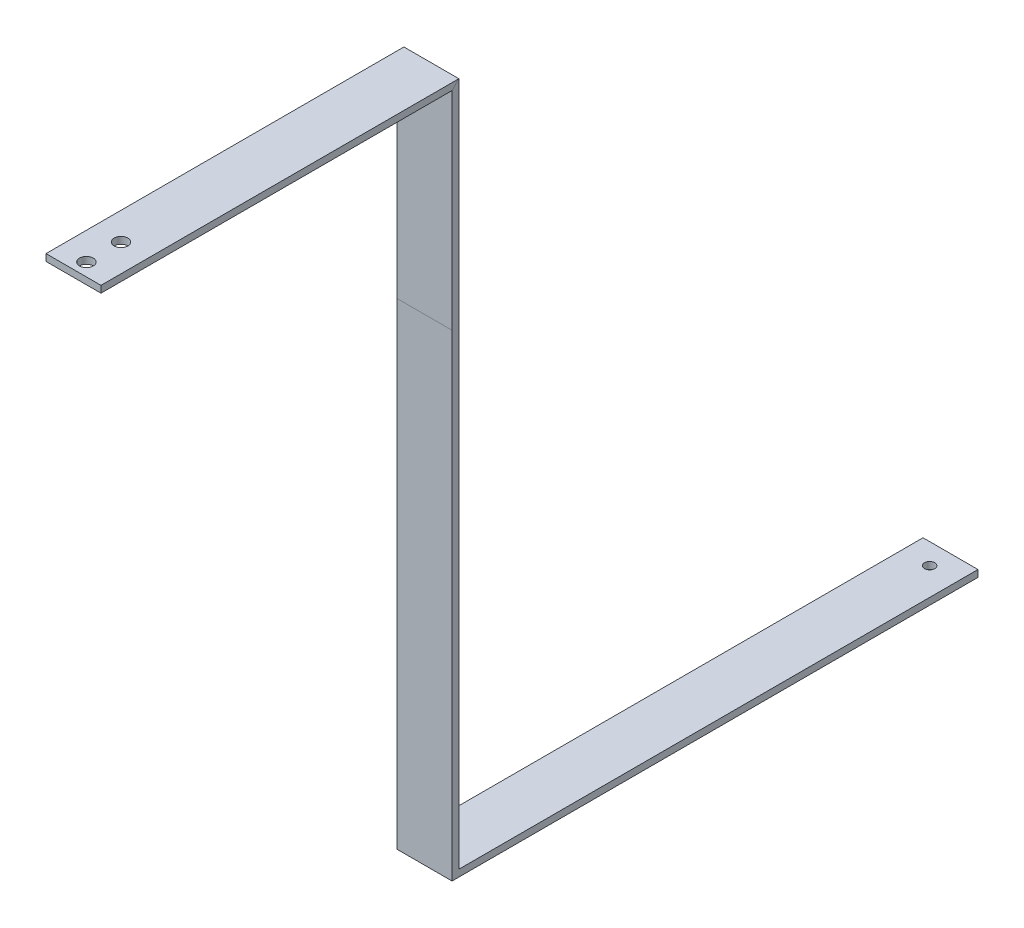
ISO-10303-21;
HEADER;
FILE_DESCRIPTION(('STEP AP214'),'2;1');
FILE_NAME('part.step','',(''),(''),'','','');
FILE_SCHEMA(('AUTOMOTIVE_DESIGN { 1 0 10303 214 1 1 1 1 }'));
ENDSEC;
DATA;
#1=APPLICATION_CONTEXT('core data for automotive mechanical design processes');
#2=APPLICATION_PROTOCOL_DEFINITION('international standard','automotive_design',2000,#1);
#3=PRODUCT_CONTEXT('',#1,'mechanical');
#4=PRODUCT('Part','Part','',(#3));
#5=PRODUCT_RELATED_PRODUCT_CATEGORY('part','',(#4));
#6=PRODUCT_DEFINITION_FORMATION('','',#4);
#7=PRODUCT_DEFINITION_CONTEXT('part definition',#1,'design');
#8=PRODUCT_DEFINITION('design','',#6,#7);
#9=PRODUCT_DEFINITION_SHAPE('','',#8);
#10=(LENGTH_UNIT() NAMED_UNIT(*) SI_UNIT(.MILLI.,.METRE.));
#11=(NAMED_UNIT(*) PLANE_ANGLE_UNIT() SI_UNIT($,.RADIAN.));
#12=(NAMED_UNIT(*) SI_UNIT($,.STERADIAN.) SOLID_ANGLE_UNIT());
#13=UNCERTAINTY_MEASURE_WITH_UNIT(LENGTH_MEASURE(1.E-05),#10,'distance_accuracy_value','');
#14=(GEOMETRIC_REPRESENTATION_CONTEXT(3) GLOBAL_UNCERTAINTY_ASSIGNED_CONTEXT((#13)) GLOBAL_UNIT_ASSIGNED_CONTEXT((#10,
#11,#12)) REPRESENTATION_CONTEXT('',''));
#15=CARTESIAN_POINT('',(0.,0.,0.));
#16=DIRECTION('',(0.,0.,1.));
#17=DIRECTION('',(1.,0.,0.));
#18=AXIS2_PLACEMENT_3D('',#15,#16,#17);
#19=CARTESIAN_POINT('',(-96.5999999999999,-272.07792076474,612.092449283312));
#20=DIRECTION('',(0.,-1.,0.));
#21=DIRECTION('',(0.,0.,-1.));
#22=AXIS2_PLACEMENT_3D('',#19,#20,#21);
#23=PLANE('',#22);
#24=DIRECTION('',(-1.,0.,0.));
#25=VECTOR('',#24,1.);
#26=CARTESIAN_POINT('',(-96.5999999999999,-272.07792076474,0.00397627219106411));
#27=LINE('',#26,#25);
#28=CARTESIAN_POINT('',(25.4,-272.07792076474,0.0039762721910086));
#29=VERTEX_POINT('',#28);
#30=CARTESIAN_POINT('',(-25.4,-272.07792076474,0.00397627219106411));
#31=VERTEX_POINT('',#30);
#32=EDGE_CURVE('E11',#29,#31,#27,.T.);
#33=ORIENTED_EDGE('',*,*,#32,.F.);
#34=DIRECTION('',(0.,0.,-1.));
#35=VECTOR('',#34,1.);
#36=CARTESIAN_POINT('',(25.4,-272.07792076474,612.092449283312));
#37=LINE('',#36,#35);
#38=CARTESIAN_POINT('',(25.4,-272.07792076474,0.));
#39=VERTEX_POINT('',#38);
#40=EDGE_CURVE('E163',#29,#39,#37,.T.);
#41=ORIENTED_EDGE('',*,*,#40,.T.);
#42=DIRECTION('',(1.,0.,0.));
#43=VECTOR('',#42,1.);
#44=CARTESIAN_POINT('',(0.,-272.07792076474,0.));
#45=LINE('',#44,#43);
#46=CARTESIAN_POINT('',(-25.4,-272.07792076474,0.));
#47=VERTEX_POINT('',#46);
#48=EDGE_CURVE('E280',#47,#39,#45,.T.);
#49=ORIENTED_EDGE('',*,*,#48,.F.);
#50=DIRECTION('',(0.,0.,-1.));
#51=VECTOR('',#50,1.);
#52=CARTESIAN_POINT('',(-25.4,-272.07792076474,574.));
#53=LINE('',#52,#51);
#54=EDGE_CURVE('E276',#31,#47,#53,.T.);
#55=ORIENTED_EDGE('',*,*,#54,.F.);
#56=EDGE_LOOP('',(#33,#41,#49,#55));
#57=FACE_BOUND('',#56,.T.);
#58=ADVANCED_FACE('F34',(#57),#23,.F.);
#59=CARTESIAN_POINT('',(25.4,3.155,574.));
#60=DIRECTION('',(-1.,0.,0.));
#61=DIRECTION('',(0.,0.,1.));
#62=AXIS2_PLACEMENT_3D('',#59,#60,#61);
#63=PLANE('',#62);
#64=DIRECTION('',(0.,1.,0.));
#65=VECTOR('',#64,1.);
#66=CARTESIAN_POINT('',(25.4,-278.803420764741,6.3139762721911));
#67=LINE('',#66,#65);
#68=CARTESIAN_POINT('',(25.4,-272.078734833776,6.31088055029496));
#69=VERTEX_POINT('',#68);
#70=CARTESIAN_POINT('',(25.4,-80.2379207647403,6.31397627219108));
#71=VERTEX_POINT('',#70);
#72=EDGE_CURVE('E177',#69,#71,#67,.T.);
#73=ORIENTED_EDGE('',*,*,#72,.F.);
#74=DIRECTION('',(0.,1.,0.));
#75=VECTOR('',#74,1.);
#76=CARTESIAN_POINT('',(25.4,-712.845,6.31000000000004));
#77=LINE('',#76,#75);
#78=CARTESIAN_POINT('',(25.4,-712.845,6.31000000000004));
#79=VERTEX_POINT('',#78);
#80=EDGE_CURVE('E38',#79,#69,#77,.T.);
#81=ORIENTED_EDGE('',*,*,#80,.F.);
#82=DIRECTION('',(0.,0.,-1.));
#83=VECTOR('',#82,1.);
#84=CARTESIAN_POINT('',(25.4,-712.845,0.));
#85=LINE('',#84,#83);
#86=CARTESIAN_POINT('',(25.4,-712.845,-479.69));
#87=VERTEX_POINT('',#86);
#88=EDGE_CURVE('E129',#79,#87,#85,.T.);
#89=ORIENTED_EDGE('',*,*,#88,.T.);
#90=DIRECTION('',(0.,1.,0.));
#91=VECTOR('',#90,1.);
#92=CARTESIAN_POINT('',(25.4,-706.535,-479.69));
#93=LINE('',#92,#91);
#94=CARTESIAN_POINT('',(25.4,-706.535,-479.69));
#95=VERTEX_POINT('',#94);
#96=EDGE_CURVE('E139',#87,#95,#93,.T.);
#97=ORIENTED_EDGE('',*,*,#96,.T.);
#98=DIRECTION('',(0.,0.,1.));
#99=VECTOR('',#98,1.);
#100=CARTESIAN_POINT('',(25.4,-706.535,-479.69));
#101=LINE('',#100,#99);
#102=CARTESIAN_POINT('',(25.4,-706.535,0.));
#103=VERTEX_POINT('',#102);
#104=EDGE_CURVE('E154',#95,#103,#101,.T.);
#105=ORIENTED_EDGE('',*,*,#104,.T.);
#106=DIRECTION('',(0.,1.,0.));
#107=VECTOR('',#106,1.);
#108=CARTESIAN_POINT('',(25.4,3.155,0.));
#109=LINE('',#108,#107);
#110=EDGE_CURVE('E52',#103,#39,#109,.T.);
#111=ORIENTED_EDGE('',*,*,#110,.T.);
#112=ORIENTED_EDGE('',*,*,#40,.F.);
#113=DIRECTION('',(0.,1.,0.));
#114=VECTOR('',#113,1.);
#115=CARTESIAN_POINT('',(25.4,-278.803420764741,0.0039762721910086));
#116=LINE('',#115,#114);
#117=CARTESIAN_POINT('',(25.4,-73.9279207647402,0.00397627219099014));
#118=VERTEX_POINT('',#117);
#119=EDGE_CURVE('E175',#29,#118,#116,.T.);
#120=ORIENTED_EDGE('',*,*,#119,.T.);
#121=DIRECTION('',(0.,0.707106781186548,-0.707106781186548));
#122=VECTOR('',#121,1.);
#123=CARTESIAN_POINT('',(25.4,-176.36567076474,102.441726272191));
#124=LINE('',#123,#122);
#125=EDGE_CURVE('E170',#71,#118,#124,.T.);
#126=ORIENTED_EDGE('',*,*,#125,.F.);
#127=EDGE_LOOP('',(#73,#81,#89,#97,#105,#111,#112,#120,#126));
#128=FACE_BOUND('',#127,.T.);
#129=ADVANCED_FACE('F36',(#128),#63,.F.);
#130=CARTESIAN_POINT('',(-25.4,3.155,574.));
#131=DIRECTION('',(1.,0.,0.));
#132=DIRECTION('',(0.,0.,-1.));
#133=AXIS2_PLACEMENT_3D('',#130,#131,#132);
#134=PLANE('',#133);
#135=DIRECTION('',(0.,-1.,0.));
#136=VECTOR('',#135,1.);
#137=CARTESIAN_POINT('',(-25.4,3.155,0.));
#138=LINE('',#137,#136);
#139=CARTESIAN_POINT('',(-25.4,-706.535,0.));
#140=VERTEX_POINT('',#139);
#141=EDGE_CURVE('E274',#47,#140,#138,.T.);
#142=ORIENTED_EDGE('',*,*,#141,.T.);
#143=DIRECTION('',(0.,0.,1.));
#144=VECTOR('',#143,1.);
#145=CARTESIAN_POINT('',(-25.4,-706.535,-479.69));
#146=LINE('',#145,#144);
#147=CARTESIAN_POINT('',(-25.4,-706.535,-479.69));
#148=VERTEX_POINT('',#147);
#149=EDGE_CURVE('E143',#148,#140,#146,.T.);
#150=ORIENTED_EDGE('',*,*,#149,.F.);
#151=DIRECTION('',(0.,-1.,0.));
#152=VECTOR('',#151,1.);
#153=CARTESIAN_POINT('',(-25.4,-706.535,-479.69));
#154=LINE('',#153,#152);
#155=CARTESIAN_POINT('',(-25.4,-712.845,-479.69));
#156=VERTEX_POINT('',#155);
#157=EDGE_CURVE('E136',#148,#156,#154,.T.);
#158=ORIENTED_EDGE('',*,*,#157,.T.);
#159=DIRECTION('',(0.,0.,1.));
#160=VECTOR('',#159,1.);
#161=CARTESIAN_POINT('',(-25.4,-712.845,0.));
#162=LINE('',#161,#160);
#163=CARTESIAN_POINT('',(-25.4,-712.845,6.31000000000004));
#164=VERTEX_POINT('',#163);
#165=EDGE_CURVE('E120',#156,#164,#162,.T.);
#166=ORIENTED_EDGE('',*,*,#165,.T.);
#167=DIRECTION('',(0.,1.,0.));
#168=VECTOR('',#167,1.);
#169=CARTESIAN_POINT('',(-25.4,-712.845,6.31000000000004));
#170=LINE('',#169,#168);
#171=CARTESIAN_POINT('',(-25.4,-272.078734833776,6.31088055029493));
#172=VERTEX_POINT('',#171);
#173=EDGE_CURVE('E262',#164,#172,#170,.T.);
#174=ORIENTED_EDGE('',*,*,#173,.T.);
#175=DIRECTION('',(0.,1.,0.));
#176=VECTOR('',#175,1.);
#177=CARTESIAN_POINT('',(-25.4,-278.803420764741,6.31397627219099));
#178=LINE('',#177,#176);
#179=CARTESIAN_POINT('',(-25.4,-80.2379207647402,6.313976272191));
#180=VERTEX_POINT('',#179);
#181=EDGE_CURVE('E173',#172,#180,#178,.T.);
#182=ORIENTED_EDGE('',*,*,#181,.T.);
#183=DIRECTION('',(0.,-0.707106781186548,0.707106781186548));
#184=VECTOR('',#183,1.);
#185=CARTESIAN_POINT('',(-25.4,-176.36567076474,102.441726272191));
#186=LINE('',#185,#184);
#187=CARTESIAN_POINT('',(-25.4,-73.9279207647402,0.00397627219099045));
#188=VERTEX_POINT('',#187);
#189=EDGE_CURVE('E164',#188,#180,#186,.T.);
#190=ORIENTED_EDGE('',*,*,#189,.F.);
#191=DIRECTION('',(0.,1.,0.));
#192=VECTOR('',#191,1.);
#193=CARTESIAN_POINT('',(-25.4,-278.803420764741,0.0039762721910086));
#194=LINE('',#193,#192);
#195=EDGE_CURVE('E171',#31,#188,#194,.T.);
#196=ORIENTED_EDGE('',*,*,#195,.F.);
#197=ORIENTED_EDGE('',*,*,#54,.T.);
#198=EDGE_LOOP('',(#142,#150,#158,#166,#174,#182,#190,#196,#197));
#199=FACE_BOUND('',#198,.T.);
#200=ADVANCED_FACE('F141',(#199),#134,.F.);
#201=CARTESIAN_POINT('',(0.,0.,0.));
#202=DIRECTION('',(0.,0.,1.));
#203=DIRECTION('',(1.,0.,0.));
#204=AXIS2_PLACEMENT_3D('',#201,#202,#203);
#205=PLANE('',#204);
#206=ORIENTED_EDGE('',*,*,#110,.F.);
#207=DIRECTION('',(-1.,0.,0.));
#208=VECTOR('',#207,1.);
#209=CARTESIAN_POINT('',(0.,-706.535,0.));
#210=LINE('',#209,#208);
#211=EDGE_CURVE('E56',#103,#140,#210,.T.);
#212=ORIENTED_EDGE('',*,*,#211,.T.);
#213=ORIENTED_EDGE('',*,*,#141,.F.);
#214=ORIENTED_EDGE('',*,*,#48,.T.);
#215=EDGE_LOOP('',(#206,#212,#213,#214));
#216=FACE_BOUND('',#215,.T.);
#217=ADVANCED_FACE('F256',(#216),#205,.F.);
#218=CARTESIAN_POINT('',(-25.4,-712.845,6.31000000000004));
#219=DIRECTION('',(0.,0.,1.));
#220=DIRECTION('',(1.,0.,0.));
#221=AXIS2_PLACEMENT_3D('',#218,#219,#220);
#222=PLANE('',#221);
#223=CARTESIAN_POINT('',(-25.4,-272.07792076474,6.31397627219099));
#224=DIRECTION('',(1.,0.,0.));
#225=VECTOR('',#224,1.);
#226=LINE('',#223,#225);
#227=EDGE_CURVE('E44',#172,#69,#226,.T.);
#228=ORIENTED_EDGE('',*,*,#227,.F.);
#229=ORIENTED_EDGE('',*,*,#173,.F.);
#230=DIRECTION('',(1.,0.,0.));
#231=VECTOR('',#230,1.);
#232=CARTESIAN_POINT('',(-25.4,-712.845,6.31000000000004));
#233=LINE('',#232,#231);
#234=EDGE_CURVE('E126',#164,#79,#233,.T.);
#235=ORIENTED_EDGE('',*,*,#234,.T.);
#236=ORIENTED_EDGE('',*,*,#80,.T.);
#237=EDGE_LOOP('',(#228,#229,#235,#236));
#238=FACE_BOUND('',#237,.T.);
#239=ADVANCED_FACE('F251',(#238),#222,.T.);
#240=CARTESIAN_POINT('',(0.,-712.845,0.));
#241=DIRECTION('',(0.,1.,0.));
#242=DIRECTION('',(0.,0.,1.));
#243=AXIS2_PLACEMENT_3D('',#240,#241,#242);
#244=PLANE('',#243);
#245=CARTESIAN_POINT('',(-1.4210854715202E-11,-712.845,-460.392204665726));
#246=DIRECTION('',(0.,1.,0.));
#247=DIRECTION('',(0.,0.,1.));
#248=AXIS2_PLACEMENT_3D('',#245,#246,#247);
#249=CIRCLE('',#248,4.7499999999999);
#250=CARTESIAN_POINT('',(-1.4210854715202E-11,-712.845,-455.642204665726));
#251=VERTEX_POINT('',#250);
#252=EDGE_CURVE('E144',#251,#251,#249,.T.);
#253=ORIENTED_EDGE('',*,*,#252,.T.);
#254=EDGE_LOOP('',(#253));
#255=FACE_BOUND('',#254,.T.);
#256=ORIENTED_EDGE('',*,*,#88,.F.);
#257=ORIENTED_EDGE('',*,*,#234,.F.);
#258=ORIENTED_EDGE('',*,*,#165,.F.);
#259=DIRECTION('',(1.,0.,0.));
#260=VECTOR('',#259,1.);
#261=CARTESIAN_POINT('',(25.4,-712.845,-479.69));
#262=LINE('',#261,#260);
#263=EDGE_CURVE('E124',#156,#87,#262,.T.);
#264=ORIENTED_EDGE('',*,*,#263,.T.);
#265=EDGE_LOOP('',(#256,#257,#258,#264));
#266=FACE_BOUND('',#265,.T.);
#267=ADVANCED_FACE('F123',(#255,#266),#244,.F.);
#268=CARTESIAN_POINT('',(-25.4,-278.803420764741,0.0039762721910086));
#269=DIRECTION('',(0.,0.,1.));
#270=DIRECTION('',(1.,0.,0.));
#271=AXIS2_PLACEMENT_3D('',#268,#269,#270);
#272=PLANE('',#271);
#273=ORIENTED_EDGE('',*,*,#119,.F.);
#274=ORIENTED_EDGE('',*,*,#32,.T.);
#275=ORIENTED_EDGE('',*,*,#195,.T.);
#276=DIRECTION('',(-1.,0.,0.));
#277=VECTOR('',#276,1.);
#278=CARTESIAN_POINT('',(-25.4,-73.9279207647403,0.0039762721910086));
#279=LINE('',#278,#277);
#280=EDGE_CURVE('E167',#118,#188,#279,.T.);
#281=ORIENTED_EDGE('',*,*,#280,.F.);
#282=EDGE_LOOP('',(#273,#274,#275,#281));
#283=FACE_BOUND('',#282,.T.);
#284=ADVANCED_FACE('F222',(#283),#272,.F.);
#285=CARTESIAN_POINT('',(0.,-352.315841529481,330.708976272191));
#286=DIRECTION('',(0.,0.,1.));
#287=DIRECTION('',(-1.,0.,0.));
#288=AXIS2_PLACEMENT_3D('',#285,#286,#287);
#289=PLANE('',#288);
#290=DIRECTION('',(0.,-1.,0.));
#291=VECTOR('',#290,1.);
#292=CARTESIAN_POINT('',(25.4,-73.9279207647402,330.708976272191));
#293=LINE('',#292,#291);
#294=CARTESIAN_POINT('',(25.4,-73.9279207647402,330.708976272191));
#295=VERTEX_POINT('',#294);
#296=CARTESIAN_POINT('',(25.4,-80.2379207647403,330.708976272191));
#297=VERTEX_POINT('',#296);
#298=EDGE_CURVE('E185',#295,#297,#293,.T.);
#299=ORIENTED_EDGE('',*,*,#298,.F.);
#300=DIRECTION('',(1.,0.,0.));
#301=VECTOR('',#300,1.);
#302=CARTESIAN_POINT('',(-25.4,-73.9279207647402,330.708976272191));
#303=LINE('',#302,#301);
#304=CARTESIAN_POINT('',(-25.4,-73.9279207647402,330.708976272191));
#305=VERTEX_POINT('',#304);
#306=EDGE_CURVE('E159',#305,#295,#303,.T.);
#307=ORIENTED_EDGE('',*,*,#306,.F.);
#308=DIRECTION('',(0.,1.,0.));
#309=VECTOR('',#308,1.);
#310=CARTESIAN_POINT('',(-25.4,-73.9279207647402,330.708976272191));
#311=LINE('',#310,#309);
#312=CARTESIAN_POINT('',(-25.4,-80.2379207647402,330.708976272191));
#313=VERTEX_POINT('',#312);
#314=EDGE_CURVE('E181',#313,#305,#311,.T.);
#315=ORIENTED_EDGE('',*,*,#314,.F.);
#316=DIRECTION('',(-1.,0.,0.));
#317=VECTOR('',#316,1.);
#318=CARTESIAN_POINT('',(-25.4,-80.2379207647402,330.708976272191));
#319=LINE('',#318,#317);
#320=EDGE_CURVE('E183',#297,#313,#319,.T.);
#321=ORIENTED_EDGE('',*,*,#320,.F.);
#322=EDGE_LOOP('',(#299,#307,#315,#321));
#323=FACE_BOUND('',#322,.T.);
#324=ADVANCED_FACE('F226',(#323),#289,.T.);
#325=CARTESIAN_POINT('',(25.4,-73.9279207647402,-0.411523727809043));
#326=DIRECTION('',(-1.,0.,0.));
#327=DIRECTION('',(0.,-1.,0.));
#328=AXIS2_PLACEMENT_3D('',#325,#326,#327);
#329=PLANE('',#328);
#330=ORIENTED_EDGE('',*,*,#125,.T.);
#331=DIRECTION('',(0.,0.,1.));
#332=VECTOR('',#331,1.);
#333=CARTESIAN_POINT('',(25.4,-73.9279207647402,-0.411523727809043));
#334=LINE('',#333,#332);
#335=EDGE_CURVE('E174',#118,#295,#334,.T.);
#336=ORIENTED_EDGE('',*,*,#335,.T.);
#337=ORIENTED_EDGE('',*,*,#298,.T.);
#338=DIRECTION('',(0.,0.,1.));
#339=VECTOR('',#338,1.);
#340=CARTESIAN_POINT('',(25.4,-80.2379207647403,-0.411523727809042));
#341=LINE('',#340,#339);
#342=EDGE_CURVE('E193',#71,#297,#341,.T.);
#343=ORIENTED_EDGE('',*,*,#342,.F.);
#344=EDGE_LOOP('',(#330,#336,#337,#343));
#345=FACE_BOUND('',#344,.T.);
#346=ADVANCED_FACE('F228',(#345),#329,.F.);
#347=CARTESIAN_POINT('',(-25.4,-80.2379207647402,-0.411523727809042));
#348=DIRECTION('',(0.,1.,0.));
#349=DIRECTION('',(-1.,0.,0.));
#350=AXIS2_PLACEMENT_3D('',#347,#348,#349);
#351=PLANE('',#350);
#352=CARTESIAN_POINT('',(-1.9443998652135E-13,-80.2379207647402,286.807795334274));
#353=DIRECTION('',(0.,1.,0.));
#354=DIRECTION('',(-1.,0.,0.));
#355=AXIS2_PLACEMENT_3D('',#352,#353,#354);
#356=CIRCLE('',#355,6.35000000001451);
#357=CARTESIAN_POINT('',(-6.3500000000147,-80.2379207647402,286.807795334274));
#358=VERTEX_POINT('',#357);
#359=EDGE_CURVE('E411',#358,#358,#356,.T.);
#360=ORIENTED_EDGE('',*,*,#359,.T.);
#361=EDGE_LOOP('',(#360));
#362=FACE_BOUND('',#361,.T.);
#363=CARTESIAN_POINT('',(1.49841716905026E-11,-80.2379207647402,318.807795334274));
#364=DIRECTION('',(0.,1.,0.));
#365=DIRECTION('',(-1.,0.,0.));
#366=AXIS2_PLACEMENT_3D('',#363,#364,#365);
#367=CIRCLE('',#366,6.34999999999997);
#368=CARTESIAN_POINT('',(-6.34999999998498,-80.2379207647402,318.807795334274));
#369=VERTEX_POINT('',#368);
#370=EDGE_CURVE('E404',#369,#369,#367,.T.);
#371=ORIENTED_EDGE('',*,*,#370,.T.);
#372=EDGE_LOOP('',(#371));
#373=FACE_BOUND('',#372,.T.);
#374=DIRECTION('',(1.,0.,0.));
#375=VECTOR('',#374,1.);
#376=CARTESIAN_POINT('',(-25.3999999999996,-80.2379207647402,6.31397627219099));
#377=LINE('',#376,#375);
#378=EDGE_CURVE('E160',#180,#71,#377,.T.);
#379=ORIENTED_EDGE('',*,*,#378,.T.);
#380=ORIENTED_EDGE('',*,*,#342,.T.);
#381=ORIENTED_EDGE('',*,*,#320,.T.);
#382=DIRECTION('',(0.,0.,1.));
#383=VECTOR('',#382,1.);
#384=CARTESIAN_POINT('',(-25.4,-80.2379207647402,-0.411523727809042));
#385=LINE('',#384,#383);
#386=EDGE_CURVE('E190',#180,#313,#385,.T.);
#387=ORIENTED_EDGE('',*,*,#386,.F.);
#388=EDGE_LOOP('',(#379,#380,#381,#387));
#389=FACE_BOUND('',#388,.T.);
#390=ADVANCED_FACE('F231',(#362,#373,#389),#351,.F.);
#391=CARTESIAN_POINT('',(-25.4,-73.9279207647402,-0.411523727809043));
#392=DIRECTION('',(1.,0.,0.));
#393=DIRECTION('',(0.,1.,0.));
#394=AXIS2_PLACEMENT_3D('',#391,#392,#393);
#395=PLANE('',#394);
#396=ORIENTED_EDGE('',*,*,#189,.T.);
#397=ORIENTED_EDGE('',*,*,#386,.T.);
#398=ORIENTED_EDGE('',*,*,#314,.T.);
#399=DIRECTION('',(0.,0.,1.));
#400=VECTOR('',#399,1.);
#401=CARTESIAN_POINT('',(-25.4,-73.9279207647402,-0.411523727809043));
#402=LINE('',#401,#400);
#403=EDGE_CURVE('E187',#188,#305,#402,.T.);
#404=ORIENTED_EDGE('',*,*,#403,.F.);
#405=EDGE_LOOP('',(#396,#397,#398,#404));
#406=FACE_BOUND('',#405,.T.);
#407=ADVANCED_FACE('F235',(#406),#395,.F.);
#408=CARTESIAN_POINT('',(-25.4,-73.9279207647402,-0.411523727809043));
#409=DIRECTION('',(0.,-1.,0.));
#410=DIRECTION('',(1.,0.,0.));
#411=AXIS2_PLACEMENT_3D('',#408,#409,#410);
#412=PLANE('',#411);
#413=CARTESIAN_POINT('',(-1.94138072097452E-13,-73.9279207647402,286.807795334274));
#414=DIRECTION('',(0.,1.,0.));
#415=DIRECTION('',(-1.,0.,0.));
#416=AXIS2_PLACEMENT_3D('',#413,#414,#415);
#417=CIRCLE('',#416,6.35000000001451);
#418=CARTESIAN_POINT('',(-6.3500000000147,-73.9279207647402,286.807795334274));
#419=VERTEX_POINT('',#418);
#420=EDGE_CURVE('E414',#419,#419,#417,.T.);
#421=ORIENTED_EDGE('',*,*,#420,.F.);
#422=EDGE_LOOP('',(#421));
#423=FACE_BOUND('',#422,.T.);
#424=CARTESIAN_POINT('',(1.49844736049265E-11,-73.9279207647402,318.807795334274));
#425=DIRECTION('',(0.,1.,0.));
#426=DIRECTION('',(-1.,0.,0.));
#427=AXIS2_PLACEMENT_3D('',#424,#425,#426);
#428=CIRCLE('',#427,6.34999999999997);
#429=CARTESIAN_POINT('',(-6.34999999998498,-73.9279207647402,318.807795334274));
#430=VERTEX_POINT('',#429);
#431=EDGE_CURVE('E406',#430,#430,#428,.T.);
#432=ORIENTED_EDGE('',*,*,#431,.F.);
#433=EDGE_LOOP('',(#432));
#434=FACE_BOUND('',#433,.T.);
#435=ORIENTED_EDGE('',*,*,#280,.T.);
#436=ORIENTED_EDGE('',*,*,#403,.T.);
#437=ORIENTED_EDGE('',*,*,#306,.T.);
#438=ORIENTED_EDGE('',*,*,#335,.F.);
#439=EDGE_LOOP('',(#435,#436,#437,#438));
#440=FACE_BOUND('',#439,.T.);
#441=ADVANCED_FACE('F221',(#423,#434,#440),#412,.F.);
#442=CARTESIAN_POINT('',(-25.4,-278.803420764741,6.31397627219099));
#443=DIRECTION('',(0.,0.,-1.));
#444=DIRECTION('',(-1.,0.,0.));
#445=AXIS2_PLACEMENT_3D('',#442,#443,#444);
#446=PLANE('',#445);
#447=ORIENTED_EDGE('',*,*,#181,.F.);
#448=ORIENTED_EDGE('',*,*,#227,.T.);
#449=ORIENTED_EDGE('',*,*,#72,.T.);
#450=ORIENTED_EDGE('',*,*,#378,.F.);
#451=EDGE_LOOP('',(#447,#448,#449,#450));
#452=FACE_BOUND('',#451,.T.);
#453=ADVANCED_FACE('F210',(#452),#446,.F.);
#454=CARTESIAN_POINT('',(25.4,-706.535,-479.69));
#455=DIRECTION('',(0.,1.,0.));
#456=DIRECTION('',(0.,0.,1.));
#457=AXIS2_PLACEMENT_3D('',#454,#455,#456);
#458=PLANE('',#457);
#459=CARTESIAN_POINT('',(-1.4210854715202E-11,-706.535,-460.392204665726));
#460=DIRECTION('',(0.,1.,0.));
#461=DIRECTION('',(0.,0.,1.));
#462=AXIS2_PLACEMENT_3D('',#459,#460,#461);
#463=CIRCLE('',#462,4.7499999999999);
#464=CARTESIAN_POINT('',(-1.4210854715202E-11,-706.535,-455.642204665726));
#465=VERTEX_POINT('',#464);
#466=EDGE_CURVE('E147',#465,#465,#463,.T.);
#467=ORIENTED_EDGE('',*,*,#466,.F.);
#468=EDGE_LOOP('',(#467));
#469=FACE_BOUND('',#468,.T.);
#470=ORIENTED_EDGE('',*,*,#211,.F.);
#471=ORIENTED_EDGE('',*,*,#104,.F.);
#472=DIRECTION('',(-1.,0.,0.));
#473=VECTOR('',#472,1.);
#474=CARTESIAN_POINT('',(25.4,-706.535,-479.69));
#475=LINE('',#474,#473);
#476=EDGE_CURVE('E152',#95,#148,#475,.T.);
#477=ORIENTED_EDGE('',*,*,#476,.T.);
#478=ORIENTED_EDGE('',*,*,#149,.T.);
#479=EDGE_LOOP('',(#470,#471,#477,#478));
#480=FACE_BOUND('',#479,.T.);
#481=ADVANCED_FACE('F220',(#469,#480),#458,.T.);
#482=CARTESIAN_POINT('',(0.,0.,-479.69));
#483=DIRECTION('',(0.,0.,-1.));
#484=DIRECTION('',(-1.,0.,0.));
#485=AXIS2_PLACEMENT_3D('',#482,#483,#484);
#486=PLANE('',#485);
#487=ORIENTED_EDGE('',*,*,#157,.F.);
#488=ORIENTED_EDGE('',*,*,#476,.F.);
#489=ORIENTED_EDGE('',*,*,#96,.F.);
#490=ORIENTED_EDGE('',*,*,#263,.F.);
#491=EDGE_LOOP('',(#487,#488,#489,#490));
#492=FACE_BOUND('',#491,.T.);
#493=ADVANCED_FACE('F134',(#492),#486,.T.);
#494=CARTESIAN_POINT('',(-1.4210854715202E-11,-712.845,-460.392204665726));
#495=DIRECTION('',(0.,1.,0.));
#496=DIRECTION('',(0.,0.,1.));
#497=AXIS2_PLACEMENT_3D('',#494,#495,#496);
#498=CYLINDRICAL_SURFACE('',#497,4.7499999999999);
#499=ORIENTED_EDGE('',*,*,#252,.F.);
#500=EDGE_LOOP('',(#499));
#501=FACE_BOUND('',#500,.T.);
#502=ORIENTED_EDGE('',*,*,#466,.T.);
#503=EDGE_LOOP('',(#502));
#504=FACE_BOUND('',#503,.T.);
#505=ADVANCED_FACE('F377',(#501,#504),#498,.F.);
#506=CARTESIAN_POINT('',(1.49841716905026E-11,-80.2379207647402,318.807795334274));
#507=DIRECTION('',(0.,1.,0.));
#508=DIRECTION('',(-1.,0.,0.));
#509=AXIS2_PLACEMENT_3D('',#506,#507,#508);
#510=CYLINDRICAL_SURFACE('',#509,6.34999999999997);
#511=ORIENTED_EDGE('',*,*,#370,.F.);
#512=EDGE_LOOP('',(#511));
#513=FACE_BOUND('',#512,.T.);
#514=ORIENTED_EDGE('',*,*,#431,.T.);
#515=EDGE_LOOP('',(#514));
#516=FACE_BOUND('',#515,.T.);
#517=ADVANCED_FACE('F371',(#513,#516),#510,.F.);
#518=CARTESIAN_POINT('',(-1.9443998652135E-13,-80.2379207647402,286.807795334274));
#519=DIRECTION('',(0.,1.,0.));
#520=DIRECTION('',(-1.,0.,0.));
#521=AXIS2_PLACEMENT_3D('',#518,#519,#520);
#522=CYLINDRICAL_SURFACE('',#521,6.35000000001451);
#523=ORIENTED_EDGE('',*,*,#359,.F.);
#524=EDGE_LOOP('',(#523));
#525=FACE_BOUND('',#524,.T.);
#526=ORIENTED_EDGE('',*,*,#420,.T.);
#527=EDGE_LOOP('',(#526));
#528=FACE_BOUND('',#527,.T.);
#529=ADVANCED_FACE('F376',(#525,#528),#522,.F.);
#530=CLOSED_SHELL('',(#58,#129,#200,#217,#239,#267,#284,#324,#346,#390,#407,#441,#453,#481,#493,
#505,#517,#529));
#531=MANIFOLD_SOLID_BREP('B2',#530);
#532=ADVANCED_BREP_SHAPE_REPRESENTATION('',(#18,#531),#14);
#533=SHAPE_DEFINITION_REPRESENTATION(#9,#532);
ENDSEC;
END-ISO-10303-21;
